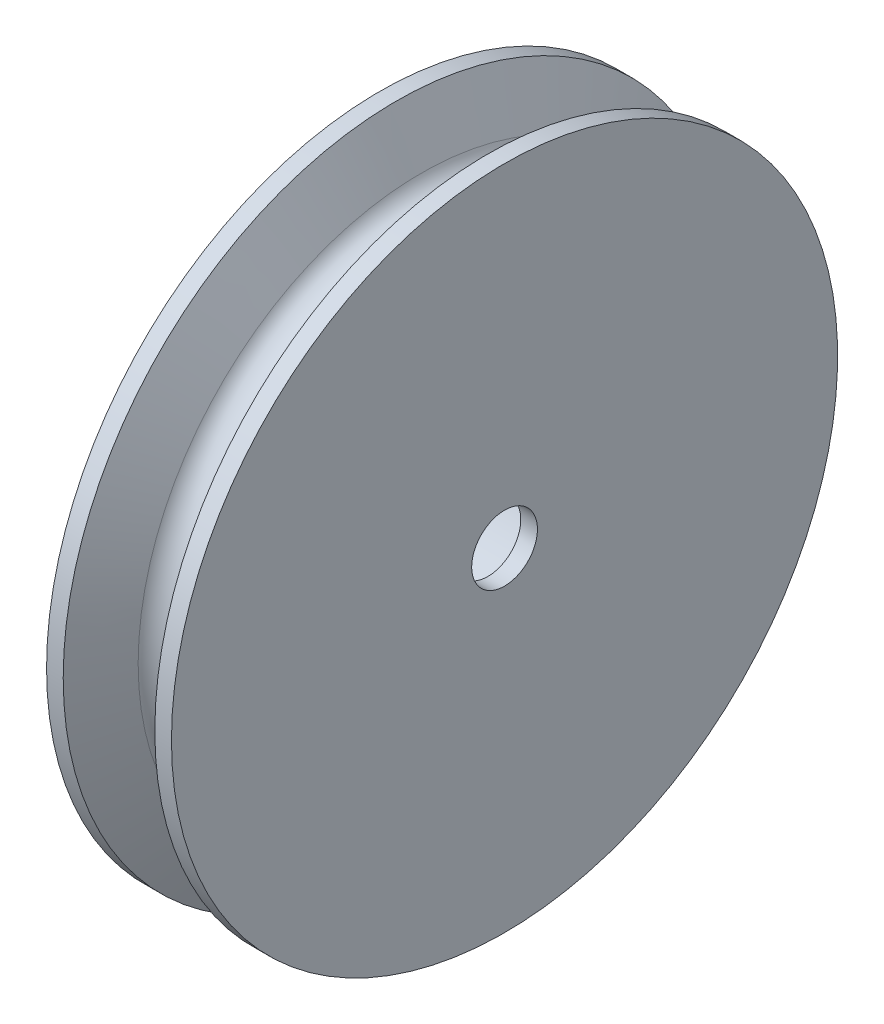
ISO-10303-21;
HEADER;
FILE_DESCRIPTION(('STEP AP214'),'2;1');
FILE_NAME('part.step','',(''),(''),'','','');
FILE_SCHEMA(('AUTOMOTIVE_DESIGN { 1 0 10303 214 1 1 1 1 }'));
ENDSEC;
DATA;
#1=APPLICATION_CONTEXT('core data for automotive mechanical design processes');
#2=APPLICATION_PROTOCOL_DEFINITION('international standard','automotive_design',2000,#1);
#3=PRODUCT_CONTEXT('',#1,'mechanical');
#4=PRODUCT('Part','Part','',(#3));
#5=PRODUCT_RELATED_PRODUCT_CATEGORY('part','',(#4));
#6=PRODUCT_DEFINITION_FORMATION('','',#4);
#7=PRODUCT_DEFINITION_CONTEXT('part definition',#1,'design');
#8=PRODUCT_DEFINITION('design','',#6,#7);
#9=PRODUCT_DEFINITION_SHAPE('','',#8);
#10=(LENGTH_UNIT() NAMED_UNIT(*) SI_UNIT(.MILLI.,.METRE.));
#11=(NAMED_UNIT(*) PLANE_ANGLE_UNIT() SI_UNIT($,.RADIAN.));
#12=(NAMED_UNIT(*) SI_UNIT($,.STERADIAN.) SOLID_ANGLE_UNIT());
#13=UNCERTAINTY_MEASURE_WITH_UNIT(LENGTH_MEASURE(1.E-05),#10,'distance_accuracy_value','');
#14=(GEOMETRIC_REPRESENTATION_CONTEXT(3) GLOBAL_UNCERTAINTY_ASSIGNED_CONTEXT((#13)) GLOBAL_UNIT_ASSIGNED_CONTEXT((#10,
#11,#12)) REPRESENTATION_CONTEXT('',''));
#15=CARTESIAN_POINT('',(0.,0.,0.));
#16=DIRECTION('',(0.,0.,1.));
#17=DIRECTION('',(1.,0.,0.));
#18=AXIS2_PLACEMENT_3D('',#15,#16,#17);
#19=CARTESIAN_POINT('',(54.9522391293207,-20.2543845102429,0.));
#20=DIRECTION('',(-1.,0.,0.));
#21=DIRECTION('',(0.,0.,1.));
#22=AXIS2_PLACEMENT_3D('',#19,#20,#21);
#23=CYLINDRICAL_SURFACE('',#22,3.95);
#24=CARTESIAN_POINT('',(7.95223912932069,-20.2543845102429,0.));
#25=DIRECTION('',(1.,0.,0.));
#26=DIRECTION('',(0.,0.,-1.));
#27=AXIS2_PLACEMENT_3D('',#24,#25,#26);
#28=CIRCLE('',#27,3.95);
#29=CARTESIAN_POINT('',(7.95223912932069,-20.2543845102429,-3.95));
#30=VERTEX_POINT('',#29);
#31=EDGE_CURVE('E63',#30,#30,#28,.T.);
#32=ORIENTED_EDGE('',*,*,#31,.T.);
#33=EDGE_LOOP('',(#32));
#34=FACE_BOUND('',#33,.T.);
#35=CARTESIAN_POINT('',(5.95223912932069,-20.2543845102429,0.));
#36=DIRECTION('',(-1.,0.,0.));
#37=DIRECTION('',(0.,0.,1.));
#38=AXIS2_PLACEMENT_3D('',#35,#36,#37);
#39=CIRCLE('',#38,3.95);
#40=CARTESIAN_POINT('',(5.95223912932069,-20.2543845102429,3.95));
#41=VERTEX_POINT('',#40);
#42=EDGE_CURVE('E49',#41,#41,#39,.F.);
#43=ORIENTED_EDGE('',*,*,#42,.F.);
#44=EDGE_LOOP('',(#43));
#45=FACE_BOUND('',#44,.T.);
#46=ADVANCED_FACE('F45',(#34,#45),#23,.F.);
#47=CARTESIAN_POINT('',(5.95223912932069,-20.2543845102429,0.));
#48=DIRECTION('',(1.,0.,0.));
#49=DIRECTION('',(0.,0.,-1.));
#50=AXIS2_PLACEMENT_3D('',#47,#48,#49);
#51=CONICAL_SURFACE('',#50,40.,1.10714871779409);
#52=CARTESIAN_POINT('',(2.95223912932069,-20.2543845102429,0.));
#53=DIRECTION('',(-1.,0.,0.));
#54=DIRECTION('',(0.,0.,1.));
#55=AXIS2_PLACEMENT_3D('',#52,#53,#54);
#56=CIRCLE('',#55,34.);
#57=CARTESIAN_POINT('',(2.95223912932069,-20.2543845102429,34.));
#58=VERTEX_POINT('',#57);
#59=EDGE_CURVE('E10',#58,#58,#56,.T.);
#60=ORIENTED_EDGE('',*,*,#59,.F.);
#61=EDGE_LOOP('',(#60));
#62=FACE_BOUND('',#61,.T.);
#63=CARTESIAN_POINT('',(5.95223912932069,-20.2543845102429,0.));
#64=DIRECTION('',(-1.,0.,0.));
#65=DIRECTION('',(0.,0.,1.));
#66=AXIS2_PLACEMENT_3D('',#63,#64,#65);
#67=CIRCLE('',#66,40.);
#68=CARTESIAN_POINT('',(5.95223912932069,-20.2543845102429,40.));
#69=VERTEX_POINT('',#68);
#70=EDGE_CURVE('E66',#69,#69,#67,.T.);
#71=ORIENTED_EDGE('',*,*,#70,.T.);
#72=EDGE_LOOP('',(#71));
#73=FACE_BOUND('',#72,.T.);
#74=ADVANCED_FACE('F47',(#62,#73),#51,.T.);
#75=CARTESIAN_POINT('',(0.452239129320688,-20.2543845102429,0.));
#76=DIRECTION('',(-1.,0.,0.));
#77=DIRECTION('',(0.,0.,1.));
#78=AXIS2_PLACEMENT_3D('',#75,#76,#77);
#79=TOROIDAL_SURFACE('',#78,35.1628386592195,2.75720759961511);
#80=CARTESIAN_POINT('',(-2.04776087067931,-20.2543845102429,0.));
#81=DIRECTION('',(-1.,0.,0.));
#82=DIRECTION('',(0.,0.,1.));
#83=AXIS2_PLACEMENT_3D('',#80,#81,#82);
#84=CIRCLE('',#83,34.);
#85=CARTESIAN_POINT('',(-2.04776087067931,-20.2543845102429,34.));
#86=VERTEX_POINT('',#85);
#87=EDGE_CURVE('E54',#86,#86,#84,.T.);
#88=ORIENTED_EDGE('',*,*,#87,.F.);
#89=EDGE_LOOP('',(#88));
#90=FACE_BOUND('',#89,.T.);
#91=ORIENTED_EDGE('',*,*,#59,.T.);
#92=EDGE_LOOP('',(#91));
#93=FACE_BOUND('',#92,.T.);
#94=ADVANCED_FACE('F103',(#90,#93),#79,.F.);
#95=CARTESIAN_POINT('',(-5.04776087067931,-20.2543845102429,0.));
#96=DIRECTION('',(-1.,0.,0.));
#97=DIRECTION('',(0.,0.,1.));
#98=AXIS2_PLACEMENT_3D('',#95,#96,#97);
#99=CONICAL_SURFACE('',#98,40.,1.10714871779409);
#100=ORIENTED_EDGE('',*,*,#87,.T.);
#101=EDGE_LOOP('',(#100));
#102=FACE_BOUND('',#101,.T.);
#103=CARTESIAN_POINT('',(-5.04776087067931,-20.2543845102429,0.));
#104=DIRECTION('',(-1.,0.,0.));
#105=DIRECTION('',(0.,0.,1.));
#106=AXIS2_PLACEMENT_3D('',#103,#104,#105);
#107=CIRCLE('',#106,40.);
#108=CARTESIAN_POINT('',(-5.04776087067931,-20.2543845102429,40.));
#109=VERTEX_POINT('',#108);
#110=EDGE_CURVE('E60',#109,#109,#107,.T.);
#111=ORIENTED_EDGE('',*,*,#110,.F.);
#112=EDGE_LOOP('',(#111));
#113=FACE_BOUND('',#112,.T.);
#114=ADVANCED_FACE('F101',(#102,#113),#99,.T.);
#115=CARTESIAN_POINT('',(-20.8444071831921,-20.2543845102429,0.));
#116=DIRECTION('',(-1.,0.,0.));
#117=DIRECTION('',(0.,0.,1.));
#118=AXIS2_PLACEMENT_3D('',#115,#116,#117);
#119=CYLINDRICAL_SURFACE('',#118,40.);
#120=ORIENTED_EDGE('',*,*,#110,.T.);
#121=EDGE_LOOP('',(#120));
#122=FACE_BOUND('',#121,.T.);
#123=CARTESIAN_POINT('',(-7.04776087067931,-20.2543845102429,0.));
#124=DIRECTION('',(-1.,0.,0.));
#125=DIRECTION('',(0.,0.,1.));
#126=AXIS2_PLACEMENT_3D('',#123,#124,#125);
#127=CIRCLE('',#126,40.);
#128=CARTESIAN_POINT('',(-7.04776087067931,-20.2543845102429,40.));
#129=VERTEX_POINT('',#128);
#130=EDGE_CURVE('E91',#129,#129,#127,.T.);
#131=ORIENTED_EDGE('',*,*,#130,.F.);
#132=EDGE_LOOP('',(#131));
#133=FACE_BOUND('',#132,.T.);
#134=ADVANCED_FACE('F98',(#122,#133),#119,.T.);
#135=CARTESIAN_POINT('',(-7.04776087067931,0.,0.));
#136=DIRECTION('',(1.,0.,0.));
#137=DIRECTION('',(0.,0.,-1.));
#138=AXIS2_PLACEMENT_3D('',#135,#136,#137);
#139=PLANE('',#138);
#140=CARTESIAN_POINT('',(-7.04776087067931,-20.2543845102429,0.));
#141=DIRECTION('',(-1.,0.,0.));
#142=DIRECTION('',(0.,0.,1.));
#143=AXIS2_PLACEMENT_3D('',#140,#141,#142);
#144=CIRCLE('',#143,10.95);
#145=CARTESIAN_POINT('',(-7.04776087067931,-20.2543845102429,10.95));
#146=VERTEX_POINT('',#145);
#147=EDGE_CURVE('E80',#146,#146,#144,.T.);
#148=ORIENTED_EDGE('',*,*,#147,.F.);
#149=EDGE_LOOP('',(#148));
#150=FACE_BOUND('',#149,.T.);
#151=ORIENTED_EDGE('',*,*,#130,.T.);
#152=EDGE_LOOP('',(#151));
#153=FACE_BOUND('',#152,.T.);
#154=ADVANCED_FACE('F110',(#150,#153),#139,.F.);
#155=CARTESIAN_POINT('',(7.95223912932069,0.,0.));
#156=DIRECTION('',(1.,0.,0.));
#157=DIRECTION('',(0.,0.,-1.));
#158=AXIS2_PLACEMENT_3D('',#155,#156,#157);
#159=PLANE('',#158);
#160=ORIENTED_EDGE('',*,*,#31,.F.);
#161=EDGE_LOOP('',(#160));
#162=FACE_BOUND('',#161,.T.);
#163=CARTESIAN_POINT('',(7.95223912932069,-20.2543845102429,0.));
#164=DIRECTION('',(-1.,0.,0.));
#165=DIRECTION('',(0.,0.,1.));
#166=AXIS2_PLACEMENT_3D('',#163,#164,#165);
#167=CIRCLE('',#166,40.);
#168=CARTESIAN_POINT('',(7.95223912932069,-20.2543845102429,40.));
#169=VERTEX_POINT('',#168);
#170=EDGE_CURVE('E72',#169,#169,#167,.T.);
#171=ORIENTED_EDGE('',*,*,#170,.F.);
#172=EDGE_LOOP('',(#171));
#173=FACE_BOUND('',#172,.T.);
#174=ADVANCED_FACE('F130',(#162,#173),#159,.T.);
#175=CARTESIAN_POINT('',(-20.8444071831921,-20.2543845102429,0.));
#176=DIRECTION('',(-1.,0.,0.));
#177=DIRECTION('',(0.,0.,1.));
#178=AXIS2_PLACEMENT_3D('',#175,#176,#177);
#179=CYLINDRICAL_SURFACE('',#178,40.);
#180=ORIENTED_EDGE('',*,*,#170,.T.);
#181=EDGE_LOOP('',(#180));
#182=FACE_BOUND('',#181,.T.);
#183=ORIENTED_EDGE('',*,*,#70,.F.);
#184=EDGE_LOOP('',(#183));
#185=FACE_BOUND('',#184,.T.);
#186=ADVANCED_FACE('F126',(#182,#185),#179,.T.);
#187=CARTESIAN_POINT('',(5.95223912932069,-20.2543845102429,0.));
#188=DIRECTION('',(-1.,0.,0.));
#189=DIRECTION('',(0.,0.,1.));
#190=AXIS2_PLACEMENT_3D('',#187,#188,#189);
#191=PLANE('',#190);
#192=CARTESIAN_POINT('',(5.95223912932069,-20.2543845102429,0.));
#193=DIRECTION('',(-1.,0.,0.));
#194=DIRECTION('',(0.,0.,1.));
#195=AXIS2_PLACEMENT_3D('',#192,#193,#194);
#196=CIRCLE('',#195,10.95);
#197=CARTESIAN_POINT('',(5.95223912932069,-20.2543845102429,10.95));
#198=VERTEX_POINT('',#197);
#199=EDGE_CURVE('E75',#198,#198,#196,.T.);
#200=ORIENTED_EDGE('',*,*,#199,.T.);
#201=EDGE_LOOP('',(#200));
#202=FACE_BOUND('',#201,.T.);
#203=ORIENTED_EDGE('',*,*,#42,.T.);
#204=EDGE_LOOP('',(#203));
#205=FACE_BOUND('',#204,.T.);
#206=ADVANCED_FACE('F129',(#202,#205),#191,.T.);
#207=CARTESIAN_POINT('',(5.95223912932069,-20.2543845102429,0.));
#208=DIRECTION('',(-1.,0.,0.));
#209=DIRECTION('',(0.,0.,1.));
#210=AXIS2_PLACEMENT_3D('',#207,#208,#209);
#211=CYLINDRICAL_SURFACE('',#210,10.95);
#212=CARTESIAN_POINT('',(5.95223912932069,-20.2543845102429,10.95));
#213=CARTESIAN_POINT('',(5.81682246265402,-20.2543845102429,10.95));
#214=CARTESIAN_POINT('',(5.68140579598736,-20.2543845102429,10.95));
#215=CARTESIAN_POINT('',(5.41057246265402,-20.2543845102429,10.95));
#216=CARTESIAN_POINT('',(5.27515579598735,-20.2543845102429,10.95));
#217=CARTESIAN_POINT('',(5.00432246265402,-20.2543845102429,10.95));
#218=CARTESIAN_POINT('',(4.86890579598736,-20.2543845102429,10.95));
#219=CARTESIAN_POINT('',(4.59807246265402,-20.2543845102429,10.95));
#220=CARTESIAN_POINT('',(4.46265579598735,-20.2543845102429,10.95));
#221=CARTESIAN_POINT('',(4.19182246265402,-20.2543845102429,10.95));
#222=CARTESIAN_POINT('',(4.05640579598736,-20.2543845102429,10.95));
#223=CARTESIAN_POINT('',(3.78557246265402,-20.2543845102429,10.95));
#224=CARTESIAN_POINT('',(3.65015579598736,-20.2543845102429,10.95));
#225=CARTESIAN_POINT('',(3.37932246265402,-20.2543845102429,10.95));
#226=CARTESIAN_POINT('',(3.24390579598736,-20.2543845102429,10.95));
#227=CARTESIAN_POINT('',(2.97307246265402,-20.2543845102429,10.95));
#228=CARTESIAN_POINT('',(2.83765579598736,-20.2543845102429,10.95));
#229=CARTESIAN_POINT('',(2.56682246265402,-20.2543845102429,10.95));
#230=CARTESIAN_POINT('',(2.43140579598736,-20.2543845102429,10.95));
#231=CARTESIAN_POINT('',(2.16057246265402,-20.2543845102429,10.95));
#232=CARTESIAN_POINT('',(2.02515579598736,-20.2543845102429,10.95));
#233=CARTESIAN_POINT('',(1.75432246265402,-20.2543845102429,10.95));
#234=CARTESIAN_POINT('',(1.61890579598736,-20.2543845102429,10.95));
#235=CARTESIAN_POINT('',(1.34807246265402,-20.2543845102429,10.95));
#236=CARTESIAN_POINT('',(1.21265579598736,-20.2543845102429,10.95));
#237=CARTESIAN_POINT('',(0.941822462654023,-20.2543845102429,10.95));
#238=CARTESIAN_POINT('',(0.806405795987356,-20.2543845102429,10.95));
#239=CARTESIAN_POINT('',(0.535572462654023,-20.2543845102429,10.95));
#240=CARTESIAN_POINT('',(0.400155795987356,-20.2543845102429,10.95));
#241=CARTESIAN_POINT('',(0.129322462654023,-20.2543845102429,10.95));
#242=CARTESIAN_POINT('',(-0.00609420401264345,-20.2543845102429,10.95));
#243=CARTESIAN_POINT('',(-0.276927537345977,-20.2543845102429,10.95));
#244=CARTESIAN_POINT('',(-0.412344204012644,-20.2543845102429,10.95));
#245=CARTESIAN_POINT('',(-0.683177537345977,-20.2543845102429,10.95));
#246=CARTESIAN_POINT('',(-0.818594204012644,-20.2543845102429,10.95));
#247=CARTESIAN_POINT('',(-1.08942753734598,-20.2543845102429,10.95));
#248=CARTESIAN_POINT('',(-1.22484420401264,-20.2543845102429,10.95));
#249=CARTESIAN_POINT('',(-1.49567753734598,-20.2543845102429,10.95));
#250=CARTESIAN_POINT('',(-1.63109420401264,-20.2543845102429,10.95));
#251=CARTESIAN_POINT('',(-1.90192753734598,-20.2543845102429,10.95));
#252=CARTESIAN_POINT('',(-2.03734420401264,-20.2543845102429,10.95));
#253=CARTESIAN_POINT('',(-2.30817753734598,-20.2543845102429,10.95));
#254=CARTESIAN_POINT('',(-2.44359420401264,-20.2543845102429,10.95));
#255=CARTESIAN_POINT('',(-2.71442753734598,-20.2543845102429,10.95));
#256=CARTESIAN_POINT('',(-2.84984420401264,-20.2543845102429,10.95));
#257=CARTESIAN_POINT('',(-3.12067753734598,-20.2543845102429,10.95));
#258=CARTESIAN_POINT('',(-3.25609420401264,-20.2543845102429,10.95));
#259=CARTESIAN_POINT('',(-3.52692753734598,-20.2543845102429,10.95));
#260=CARTESIAN_POINT('',(-3.66234420401264,-20.2543845102429,10.95));
#261=CARTESIAN_POINT('',(-3.93317753734598,-20.2543845102429,10.95));
#262=CARTESIAN_POINT('',(-4.06859420401264,-20.2543845102429,10.95));
#263=CARTESIAN_POINT('',(-4.33942753734598,-20.2543845102429,10.95));
#264=CARTESIAN_POINT('',(-4.47484420401264,-20.2543845102429,10.95));
#265=CARTESIAN_POINT('',(-4.74567753734598,-20.2543845102429,10.95));
#266=CARTESIAN_POINT('',(-4.88109420401264,-20.2543845102429,10.95));
#267=CARTESIAN_POINT('',(-5.15192753734598,-20.2543845102429,10.95));
#268=CARTESIAN_POINT('',(-5.28734420401265,-20.2543845102429,10.95));
#269=CARTESIAN_POINT('',(-5.55817753734598,-20.2543845102429,10.95));
#270=CARTESIAN_POINT('',(-5.69359420401265,-20.2543845102429,10.95));
#271=CARTESIAN_POINT('',(-5.96442753734598,-20.2543845102429,10.95));
#272=CARTESIAN_POINT('',(-6.09984420401264,-20.2543845102429,10.95));
#273=CARTESIAN_POINT('',(-6.37067753734598,-20.2543845102429,10.95));
#274=CARTESIAN_POINT('',(-6.50609420401264,-20.2543845102429,10.95));
#275=CARTESIAN_POINT('',(-6.77692753734598,-20.2543845102429,10.95));
#276=CARTESIAN_POINT('',(-6.91234420401264,-20.2543845102429,10.95));
#277=CARTESIAN_POINT('',(-7.04776087067931,-20.2543845102429,10.95));
#278=B_SPLINE_CURVE_WITH_KNOTS('',3,(#212,#213,#214,#215,#216,#217,#218,#219,#220,#221,#222,
#223,#224,#225,#226,#227,#228,#229,#230,#231,#232,#233,#234,#235,#236,#237,#238,#239,#240,#241,
#242,#243,#244,#245,#246,#247,#248,#249,#250,#251,#252,#253,#254,#255,#256,#257,#258,#259,#260,
#261,#262,#263,#264,#265,#266,#267,#268,#269,#270,#271,#272,#273,#274,#275,#276,#277),
.UNSPECIFIED.,.F.,.F.,(4,2,2,2,2,2,2,2,2,2,2,2,2,2,2,2,2,2,2,2,2,2,2,2,2,2,2,2,2,2,2,2,4),(0.,
0.40625,0.812500000000001,1.21875,1.625,2.03125,2.4375,2.84375,3.25,3.65625,4.0625,4.46875,
4.875,5.28125,5.6875,6.09375,6.5,6.90625,7.3125,7.71875,8.125,8.53125,8.9375,9.34375,9.75,
10.15625,10.5625,10.96875,11.375,11.78125,12.1875,12.59375,13.),.UNSPECIFIED.);
#279=EDGE_CURVE('BSEAM124',#198,#146,#278,.T.);
#280=ORIENTED_EDGE('',*,*,#199,.F.);
#281=ORIENTED_EDGE('',*,*,#147,.T.);
#282=ORIENTED_EDGE('',*,*,#279,.T.);
#283=ORIENTED_EDGE('',*,*,#279,.F.);
#284=EDGE_LOOP('',(#280,#282,#281,#283));
#285=FACE_BOUND('',#284,.T.);
#286=ADVANCED_FACE('F124',(#285),#211,.F.);
#287=CLOSED_SHELL('',(#46,#74,#94,#114,#134,#154,#174,#186,#206,#286));
#288=MANIFOLD_SOLID_BREP('B2',#287);
#289=ADVANCED_BREP_SHAPE_REPRESENTATION('',(#18,#288),#14);
#290=SHAPE_DEFINITION_REPRESENTATION(#9,#289);
ENDSEC;
END-ISO-10303-21;
